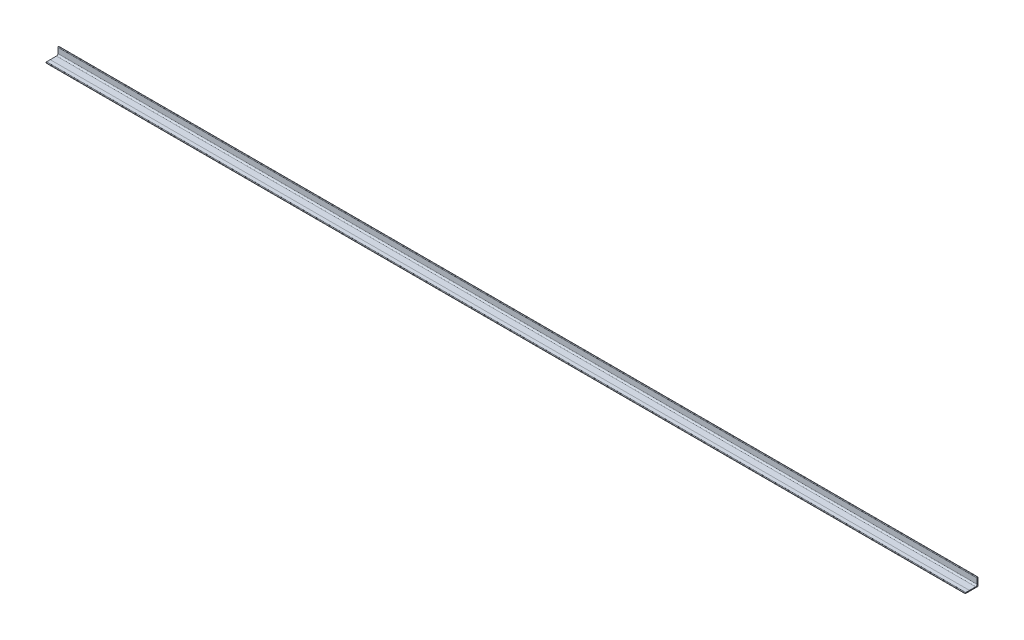
ISO-10303-21;
HEADER;
FILE_DESCRIPTION(('STEP AP214'),'2;1');
FILE_NAME('part.step','',(''),(''),'','','');
FILE_SCHEMA(('AUTOMOTIVE_DESIGN { 1 0 10303 214 1 1 1 1 }'));
ENDSEC;
DATA;
#1=APPLICATION_CONTEXT('core data for automotive mechanical design processes');
#2=APPLICATION_PROTOCOL_DEFINITION('international standard','automotive_design',2000,#1);
#3=PRODUCT_CONTEXT('',#1,'mechanical');
#4=PRODUCT('Part','Part','',(#3));
#5=PRODUCT_RELATED_PRODUCT_CATEGORY('part','',(#4));
#6=PRODUCT_DEFINITION_FORMATION('','',#4);
#7=PRODUCT_DEFINITION_CONTEXT('part definition',#1,'design');
#8=PRODUCT_DEFINITION('design','',#6,#7);
#9=PRODUCT_DEFINITION_SHAPE('','',#8);
#10=(LENGTH_UNIT() NAMED_UNIT(*) SI_UNIT(.MILLI.,.METRE.));
#11=(NAMED_UNIT(*) PLANE_ANGLE_UNIT() SI_UNIT($,.RADIAN.));
#12=(NAMED_UNIT(*) SI_UNIT($,.STERADIAN.) SOLID_ANGLE_UNIT());
#13=UNCERTAINTY_MEASURE_WITH_UNIT(LENGTH_MEASURE(1.E-05),#10,'distance_accuracy_value','');
#14=(GEOMETRIC_REPRESENTATION_CONTEXT(3) GLOBAL_UNCERTAINTY_ASSIGNED_CONTEXT((#13)) GLOBAL_UNIT_ASSIGNED_CONTEXT((#10,
#11,#12)) REPRESENTATION_CONTEXT('',''));
#15=CARTESIAN_POINT('',(0.,0.,0.));
#16=DIRECTION('',(0.,0.,1.));
#17=DIRECTION('',(1.,0.,0.));
#18=AXIS2_PLACEMENT_3D('',#15,#16,#17);
#19=CARTESIAN_POINT('',(0.,4.6,67.));
#20=DIRECTION('',(1.,0.,0.));
#21=DIRECTION('',(0.,0.,-1.));
#22=AXIS2_PLACEMENT_3D('',#19,#20,#21);
#23=PLANE('',#22);
#24=DIRECTION('',(0.,0.,1.));
#25=VECTOR('',#24,1.);
#26=CARTESIAN_POINT('',(0.,4.5,67.));
#27=LINE('',#26,#25);
#28=CARTESIAN_POINT('',(0.,4.5,47.));
#29=VERTEX_POINT('',#28);
#30=CARTESIAN_POINT('',(0.,4.5,67.));
#31=VERTEX_POINT('',#30);
#32=EDGE_CURVE('E142',#29,#31,#27,.T.);
#33=ORIENTED_EDGE('',*,*,#32,.T.);
#34=DIRECTION('',(0.,-1.,0.));
#35=VECTOR('',#34,1.);
#36=CARTESIAN_POINT('',(0.,4.6,67.));
#37=LINE('',#36,#35);
#38=CARTESIAN_POINT('',(0.,4.6,67.));
#39=VERTEX_POINT('',#38);
#40=EDGE_CURVE('E14',#39,#31,#37,.T.);
#41=ORIENTED_EDGE('',*,*,#40,.F.);
#42=DIRECTION('',(0.,0.,1.));
#43=VECTOR('',#42,1.);
#44=CARTESIAN_POINT('',(0.,4.6,67.));
#45=LINE('',#44,#43);
#46=CARTESIAN_POINT('',(0.,4.6,47.));
#47=VERTEX_POINT('',#46);
#48=EDGE_CURVE('E130',#47,#39,#45,.T.);
#49=ORIENTED_EDGE('',*,*,#48,.F.);
#50=DIRECTION('',(0.,-1.,0.));
#51=VECTOR('',#50,1.);
#52=CARTESIAN_POINT('',(0.,4.6,47.));
#53=LINE('',#52,#51);
#54=EDGE_CURVE('E138',#47,#29,#53,.T.);
#55=ORIENTED_EDGE('',*,*,#54,.T.);
#56=EDGE_LOOP('',(#33,#41,#49,#55));
#57=FACE_BOUND('',#56,.T.);
#58=ADVANCED_FACE('F79',(#57),#23,.F.);
#59=CARTESIAN_POINT('',(0.,4.6,67.));
#60=DIRECTION('',(0.,0.,-1.));
#61=DIRECTION('',(-1.,0.,0.));
#62=AXIS2_PLACEMENT_3D('',#59,#60,#61);
#63=PLANE('',#62);
#64=DIRECTION('',(1.,0.,0.));
#65=VECTOR('',#64,1.);
#66=CARTESIAN_POINT('',(0.,4.5,67.));
#67=LINE('',#66,#65);
#68=CARTESIAN_POINT('',(5060.,4.5,67.));
#69=VERTEX_POINT('',#68);
#70=EDGE_CURVE('E134',#31,#69,#67,.T.);
#71=ORIENTED_EDGE('',*,*,#70,.T.);
#72=DIRECTION('',(0.,-1.,0.));
#73=VECTOR('',#72,1.);
#74=CARTESIAN_POINT('',(5060.,4.6,67.));
#75=LINE('',#74,#73);
#76=CARTESIAN_POINT('',(5060.,4.6,67.));
#77=VERTEX_POINT('',#76);
#78=EDGE_CURVE('E87',#77,#69,#75,.T.);
#79=ORIENTED_EDGE('',*,*,#78,.F.);
#80=DIRECTION('',(1.,0.,0.));
#81=VECTOR('',#80,1.);
#82=CARTESIAN_POINT('',(0.,4.6,67.));
#83=LINE('',#82,#81);
#84=EDGE_CURVE('E125',#39,#77,#83,.T.);
#85=ORIENTED_EDGE('',*,*,#84,.F.);
#86=ORIENTED_EDGE('',*,*,#40,.T.);
#87=EDGE_LOOP('',(#71,#79,#85,#86));
#88=FACE_BOUND('',#87,.T.);
#89=ADVANCED_FACE('F133',(#88),#63,.F.);
#90=CARTESIAN_POINT('',(5060.,4.6,67.));
#91=DIRECTION('',(-1.,0.,0.));
#92=DIRECTION('',(0.,0.,1.));
#93=AXIS2_PLACEMENT_3D('',#90,#91,#92);
#94=PLANE('',#93);
#95=DIRECTION('',(0.,0.,-1.));
#96=VECTOR('',#95,1.);
#97=CARTESIAN_POINT('',(5060.,4.5,67.));
#98=LINE('',#97,#96);
#99=CARTESIAN_POINT('',(5060.,4.5,47.));
#100=VERTEX_POINT('',#99);
#101=EDGE_CURVE('E112',#69,#100,#98,.T.);
#102=ORIENTED_EDGE('',*,*,#101,.T.);
#103=DIRECTION('',(0.,-1.,0.));
#104=VECTOR('',#103,1.);
#105=CARTESIAN_POINT('',(5060.,4.6,47.));
#106=LINE('',#105,#104);
#107=CARTESIAN_POINT('',(5060.,4.6,47.));
#108=VERTEX_POINT('',#107);
#109=EDGE_CURVE('E135',#108,#100,#106,.T.);
#110=ORIENTED_EDGE('',*,*,#109,.F.);
#111=DIRECTION('',(0.,0.,-1.));
#112=VECTOR('',#111,1.);
#113=CARTESIAN_POINT('',(5060.,4.6,67.));
#114=LINE('',#113,#112);
#115=EDGE_CURVE('E128',#77,#108,#114,.T.);
#116=ORIENTED_EDGE('',*,*,#115,.F.);
#117=ORIENTED_EDGE('',*,*,#78,.T.);
#118=EDGE_LOOP('',(#102,#110,#116,#117));
#119=FACE_BOUND('',#118,.T.);
#120=ADVANCED_FACE('F136',(#119),#94,.F.);
#121=CARTESIAN_POINT('',(0.,4.6,47.));
#122=DIRECTION('',(0.,0.,1.));
#123=DIRECTION('',(1.,0.,0.));
#124=AXIS2_PLACEMENT_3D('',#121,#122,#123);
#125=PLANE('',#124);
#126=DIRECTION('',(-1.,0.,0.));
#127=VECTOR('',#126,1.);
#128=CARTESIAN_POINT('',(0.,4.5,47.));
#129=LINE('',#128,#127);
#130=EDGE_CURVE('E118',#100,#29,#129,.T.);
#131=ORIENTED_EDGE('',*,*,#130,.T.);
#132=ORIENTED_EDGE('',*,*,#54,.F.);
#133=DIRECTION('',(-1.,0.,0.));
#134=VECTOR('',#133,1.);
#135=CARTESIAN_POINT('',(0.,4.6,47.));
#136=LINE('',#135,#134);
#137=EDGE_CURVE('E95',#108,#47,#136,.T.);
#138=ORIENTED_EDGE('',*,*,#137,.F.);
#139=ORIENTED_EDGE('',*,*,#109,.T.);
#140=EDGE_LOOP('',(#131,#132,#138,#139));
#141=FACE_BOUND('',#140,.T.);
#142=ADVANCED_FACE('F149',(#141),#125,.F.);
#143=CARTESIAN_POINT('',(0.,4.6,0.));
#144=DIRECTION('',(0.,-1.,0.));
#145=DIRECTION('',(0.,0.,-1.));
#146=AXIS2_PLACEMENT_3D('',#143,#144,#145);
#147=PLANE('',#146);
#148=ORIENTED_EDGE('',*,*,#48,.T.);
#149=ORIENTED_EDGE('',*,*,#84,.T.);
#150=ORIENTED_EDGE('',*,*,#115,.T.);
#151=ORIENTED_EDGE('',*,*,#137,.T.);
#152=EDGE_LOOP('',(#148,#149,#150,#151));
#153=FACE_BOUND('',#152,.T.);
#154=ADVANCED_FACE('F126',(#153),#147,.F.);
#155=CARTESIAN_POINT('',(0.,4.5,0.));
#156=DIRECTION('',(0.,-1.,0.));
#157=DIRECTION('',(0.,0.,-1.));
#158=AXIS2_PLACEMENT_3D('',#155,#156,#157);
#159=PLANE('',#158);
#160=ORIENTED_EDGE('',*,*,#32,.F.);
#161=ORIENTED_EDGE('',*,*,#130,.F.);
#162=ORIENTED_EDGE('',*,*,#101,.F.);
#163=ORIENTED_EDGE('',*,*,#70,.F.);
#164=EDGE_LOOP('',(#160,#161,#162,#163));
#165=FACE_BOUND('',#164,.T.);
#166=ADVANCED_FACE('F152',(#165),#159,.T.);
#167=CLOSED_SHELL('',(#58,#89,#120,#142,#154,#166));
#168=MANIFOLD_SOLID_BREP('B2',#167);
#169=CARTESIAN_POINT('',(5060.,0.,0.));
#170=DIRECTION('',(0.,0.,1.));
#171=DIRECTION('',(1.,0.,0.));
#172=AXIS2_PLACEMENT_3D('',#169,#170,#171);
#173=PLANE('',#172);
#174=DIRECTION('',(0.,1.,0.));
#175=VECTOR('',#174,1.);
#176=CARTESIAN_POINT('',(0.,0.,0.));
#177=LINE('',#176,#175);
#178=CARTESIAN_POINT('',(0.,0.,0.));
#179=VERTEX_POINT('',#178);
#180=CARTESIAN_POINT('',(0.,45.,0.));
#181=VERTEX_POINT('',#180);
#182=EDGE_CURVE('E304',#179,#181,#177,.T.);
#183=ORIENTED_EDGE('',*,*,#182,.T.);
#184=DIRECTION('',(-1.,0.,0.));
#185=VECTOR('',#184,1.);
#186=CARTESIAN_POINT('',(5060.,45.,0.));
#187=LINE('',#186,#185);
#188=CARTESIAN_POINT('',(5060.,45.,0.));
#189=VERTEX_POINT('',#188);
#190=EDGE_CURVE('E77',#189,#181,#187,.T.);
#191=ORIENTED_EDGE('',*,*,#190,.F.);
#192=DIRECTION('',(0.,1.,0.));
#193=VECTOR('',#192,1.);
#194=CARTESIAN_POINT('',(5060.,0.,0.));
#195=LINE('',#194,#193);
#196=CARTESIAN_POINT('',(5060.,0.,0.));
#197=VERTEX_POINT('',#196);
#198=EDGE_CURVE('E320',#197,#189,#195,.T.);
#199=ORIENTED_EDGE('',*,*,#198,.F.);
#200=DIRECTION('',(-1.,0.,0.));
#201=VECTOR('',#200,1.);
#202=CARTESIAN_POINT('',(5060.,0.,0.));
#203=LINE('',#202,#201);
#204=EDGE_CURVE('E300',#197,#179,#203,.T.);
#205=ORIENTED_EDGE('',*,*,#204,.T.);
#206=EDGE_LOOP('',(#183,#191,#199,#205));
#207=FACE_BOUND('',#206,.T.);
#208=ADVANCED_FACE('F202',(#207),#173,.F.);
#209=CARTESIAN_POINT('',(5060.,45.,0.));
#210=DIRECTION('',(0.,-1.,0.));
#211=DIRECTION('',(0.,0.,-1.));
#212=AXIS2_PLACEMENT_3D('',#209,#210,#211);
#213=PLANE('',#212);
#214=DIRECTION('',(0.,0.,1.));
#215=VECTOR('',#214,1.);
#216=CARTESIAN_POINT('',(0.,45.,0.));
#217=LINE('',#216,#215);
#218=CARTESIAN_POINT('',(0.,45.,1.49999999999998));
#219=VERTEX_POINT('',#218);
#220=EDGE_CURVE('E307',#181,#219,#217,.T.);
#221=ORIENTED_EDGE('',*,*,#220,.T.);
#222=DIRECTION('',(-1.,0.,0.));
#223=VECTOR('',#222,1.);
#224=CARTESIAN_POINT('',(5060.,45.,1.49999999999998));
#225=LINE('',#224,#223);
#226=CARTESIAN_POINT('',(5060.,45.,1.49999999999998));
#227=VERTEX_POINT('',#226);
#228=EDGE_CURVE('E210',#227,#219,#225,.T.);
#229=ORIENTED_EDGE('',*,*,#228,.F.);
#230=DIRECTION('',(0.,0.,1.));
#231=VECTOR('',#230,1.);
#232=CARTESIAN_POINT('',(5060.,45.,0.));
#233=LINE('',#232,#231);
#234=EDGE_CURVE('E264',#189,#227,#233,.T.);
#235=ORIENTED_EDGE('',*,*,#234,.F.);
#236=ORIENTED_EDGE('',*,*,#190,.T.);
#237=EDGE_LOOP('',(#221,#229,#235,#236));
#238=FACE_BOUND('',#237,.T.);
#239=ADVANCED_FACE('F363',(#238),#213,.F.);
#240=CARTESIAN_POINT('',(5060.,42.,1.5));
#241=DIRECTION('',(-1.,0.,0.));
#242=DIRECTION('',(0.,0.,1.));
#243=AXIS2_PLACEMENT_3D('',#240,#241,#242);
#244=CYLINDRICAL_SURFACE('',#243,3.);
#245=CARTESIAN_POINT('',(0.,42.,1.5));
#246=DIRECTION('',(1.,0.,0.));
#247=DIRECTION('',(0.,0.,-1.));
#248=AXIS2_PLACEMENT_3D('',#245,#246,#247);
#249=CIRCLE('',#248,3.);
#250=CARTESIAN_POINT('',(0.,42.,4.5));
#251=VERTEX_POINT('',#250);
#252=EDGE_CURVE('E309',#219,#251,#249,.T.);
#253=ORIENTED_EDGE('',*,*,#252,.T.);
#254=DIRECTION('',(-1.,0.,0.));
#255=VECTOR('',#254,1.);
#256=CARTESIAN_POINT('',(5060.,42.,4.5));
#257=LINE('',#256,#255);
#258=CARTESIAN_POINT('',(5060.,42.,4.5));
#259=VERTEX_POINT('',#258);
#260=EDGE_CURVE('E330',#259,#251,#257,.T.);
#261=ORIENTED_EDGE('',*,*,#260,.F.);
#262=CARTESIAN_POINT('',(5060.,42.,1.5));
#263=DIRECTION('',(1.,0.,0.));
#264=DIRECTION('',(0.,0.,-1.));
#265=AXIS2_PLACEMENT_3D('',#262,#263,#264);
#266=CIRCLE('',#265,3.);
#267=EDGE_CURVE('E338',#227,#259,#266,.T.);
#268=ORIENTED_EDGE('',*,*,#267,.F.);
#269=ORIENTED_EDGE('',*,*,#228,.T.);
#270=EDGE_LOOP('',(#253,#261,#268,#269));
#271=FACE_BOUND('',#270,.T.);
#272=ADVANCED_FACE('F336',(#271),#244,.T.);
#273=CARTESIAN_POINT('',(5060.,12.5000000000001,4.5));
#274=DIRECTION('',(0.,0.,-1.));
#275=DIRECTION('',(-1.,0.,0.));
#276=AXIS2_PLACEMENT_3D('',#273,#274,#275);
#277=PLANE('',#276);
#278=DIRECTION('',(0.,-1.,0.));
#279=VECTOR('',#278,1.);
#280=CARTESIAN_POINT('',(0.,12.5000000000001,4.5));
#281=LINE('',#280,#279);
#282=CARTESIAN_POINT('',(0.,12.5000000000001,4.5));
#283=VERTEX_POINT('',#282);
#284=EDGE_CURVE('E311',#251,#283,#281,.T.);
#285=ORIENTED_EDGE('',*,*,#284,.T.);
#286=DIRECTION('',(-1.,0.,0.));
#287=VECTOR('',#286,1.);
#288=CARTESIAN_POINT('',(5060.,12.5000000000001,4.5));
#289=LINE('',#288,#287);
#290=CARTESIAN_POINT('',(5060.,12.5000000000001,4.5));
#291=VERTEX_POINT('',#290);
#292=EDGE_CURVE('E327',#291,#283,#289,.T.);
#293=ORIENTED_EDGE('',*,*,#292,.F.);
#294=DIRECTION('',(0.,-1.,0.));
#295=VECTOR('',#294,1.);
#296=CARTESIAN_POINT('',(5060.,12.5000000000001,4.5));
#297=LINE('',#296,#295);
#298=EDGE_CURVE('E354',#259,#291,#297,.T.);
#299=ORIENTED_EDGE('',*,*,#298,.F.);
#300=ORIENTED_EDGE('',*,*,#260,.T.);
#301=EDGE_LOOP('',(#285,#293,#299,#300));
#302=FACE_BOUND('',#301,.T.);
#303=ADVANCED_FACE('F347',(#302),#277,.F.);
#304=CARTESIAN_POINT('',(5060.,12.5,12.5));
#305=DIRECTION('',(-1.,0.,0.));
#306=DIRECTION('',(0.,0.,1.));
#307=AXIS2_PLACEMENT_3D('',#304,#305,#306);
#308=CYLINDRICAL_SURFACE('',#307,8.);
#309=CARTESIAN_POINT('',(0.,12.5,12.5));
#310=DIRECTION('',(-1.,0.,0.));
#311=DIRECTION('',(0.,0.,1.));
#312=AXIS2_PLACEMENT_3D('',#309,#310,#311);
#313=CIRCLE('',#312,8.);
#314=CARTESIAN_POINT('',(0.,4.5,12.5000000000001));
#315=VERTEX_POINT('',#314);
#316=EDGE_CURVE('E313',#283,#315,#313,.T.);
#317=ORIENTED_EDGE('',*,*,#316,.T.);
#318=DIRECTION('',(-1.,0.,0.));
#319=VECTOR('',#318,1.);
#320=CARTESIAN_POINT('',(5060.,4.5,12.5000000000001));
#321=LINE('',#320,#319);
#322=CARTESIAN_POINT('',(5060.,4.5,12.5000000000001));
#323=VERTEX_POINT('',#322);
#324=EDGE_CURVE('E324',#323,#315,#321,.T.);
#325=ORIENTED_EDGE('',*,*,#324,.F.);
#326=CARTESIAN_POINT('',(5060.,12.5,12.5));
#327=DIRECTION('',(-1.,0.,0.));
#328=DIRECTION('',(0.,0.,1.));
#329=AXIS2_PLACEMENT_3D('',#326,#327,#328);
#330=CIRCLE('',#329,8.);
#331=EDGE_CURVE('E353',#291,#323,#330,.T.);
#332=ORIENTED_EDGE('',*,*,#331,.F.);
#333=ORIENTED_EDGE('',*,*,#292,.T.);
#334=EDGE_LOOP('',(#317,#325,#332,#333));
#335=FACE_BOUND('',#334,.T.);
#336=ADVANCED_FACE('F351',(#335),#308,.F.);
#337=CARTESIAN_POINT('',(5060.,4.5,12.5000000000001));
#338=DIRECTION('',(0.,-1.,0.));
#339=DIRECTION('',(0.,0.,-1.));
#340=AXIS2_PLACEMENT_3D('',#337,#338,#339);
#341=PLANE('',#340);
#342=DIRECTION('',(0.,0.,1.));
#343=VECTOR('',#342,1.);
#344=CARTESIAN_POINT('',(0.,4.5,12.5000000000001));
#345=LINE('',#344,#343);
#346=CARTESIAN_POINT('',(0.,4.5,67.));
#347=VERTEX_POINT('',#346);
#348=EDGE_CURVE('E315',#315,#347,#345,.T.);
#349=ORIENTED_EDGE('',*,*,#348,.T.);
#350=DIRECTION('',(-1.,0.,0.));
#351=VECTOR('',#350,1.);
#352=CARTESIAN_POINT('',(5060.,4.5,67.));
#353=LINE('',#352,#351);
#354=CARTESIAN_POINT('',(5060.,4.5,67.));
#355=VERTEX_POINT('',#354);
#356=EDGE_CURVE('E295',#355,#347,#353,.T.);
#357=ORIENTED_EDGE('',*,*,#356,.F.);
#358=DIRECTION('',(0.,0.,1.));
#359=VECTOR('',#358,1.);
#360=CARTESIAN_POINT('',(5060.,4.5,12.5000000000001));
#361=LINE('',#360,#359);
#362=EDGE_CURVE('E286',#323,#355,#361,.T.);
#363=ORIENTED_EDGE('',*,*,#362,.F.);
#364=ORIENTED_EDGE('',*,*,#324,.T.);
#365=EDGE_LOOP('',(#349,#357,#363,#364));
#366=FACE_BOUND('',#365,.T.);
#367=ADVANCED_FACE('F375',(#366),#341,.F.);
#368=CARTESIAN_POINT('',(5060.,1.5,67.));
#369=DIRECTION('',(-1.,0.,0.));
#370=DIRECTION('',(0.,0.,1.));
#371=AXIS2_PLACEMENT_3D('',#368,#369,#370);
#372=CYLINDRICAL_SURFACE('',#371,3.);
#373=CARTESIAN_POINT('',(0.,1.5,67.));
#374=DIRECTION('',(1.,0.,0.));
#375=DIRECTION('',(0.,0.,-1.));
#376=AXIS2_PLACEMENT_3D('',#373,#374,#375);
#377=CIRCLE('',#376,3.);
#378=CARTESIAN_POINT('',(0.,1.49999999999998,70.));
#379=VERTEX_POINT('',#378);
#380=EDGE_CURVE('E294',#347,#379,#377,.T.);
#381=ORIENTED_EDGE('',*,*,#380,.T.);
#382=DIRECTION('',(-1.,0.,0.));
#383=VECTOR('',#382,1.);
#384=CARTESIAN_POINT('',(5060.,1.49999999999998,70.));
#385=LINE('',#384,#383);
#386=CARTESIAN_POINT('',(5060.,1.49999999999998,70.));
#387=VERTEX_POINT('',#386);
#388=EDGE_CURVE('E291',#387,#379,#385,.T.);
#389=ORIENTED_EDGE('',*,*,#388,.F.);
#390=CARTESIAN_POINT('',(5060.,1.5,67.));
#391=DIRECTION('',(1.,0.,0.));
#392=DIRECTION('',(0.,0.,-1.));
#393=AXIS2_PLACEMENT_3D('',#390,#391,#392);
#394=CIRCLE('',#393,3.);
#395=EDGE_CURVE('E280',#355,#387,#394,.T.);
#396=ORIENTED_EDGE('',*,*,#395,.F.);
#397=ORIENTED_EDGE('',*,*,#356,.T.);
#398=EDGE_LOOP('',(#381,#389,#396,#397));
#399=FACE_BOUND('',#398,.T.);
#400=ADVANCED_FACE('F292',(#399),#372,.T.);
#401=CARTESIAN_POINT('',(5060.,0.,70.));
#402=DIRECTION('',(0.,0.,-1.));
#403=DIRECTION('',(-1.,0.,0.));
#404=AXIS2_PLACEMENT_3D('',#401,#402,#403);
#405=PLANE('',#404);
#406=DIRECTION('',(0.,-1.,0.));
#407=VECTOR('',#406,1.);
#408=CARTESIAN_POINT('',(0.,0.,70.));
#409=LINE('',#408,#407);
#410=CARTESIAN_POINT('',(0.,0.,70.));
#411=VERTEX_POINT('',#410);
#412=EDGE_CURVE('E250',#379,#411,#409,.T.);
#413=ORIENTED_EDGE('',*,*,#412,.T.);
#414=DIRECTION('',(-1.,0.,0.));
#415=VECTOR('',#414,1.);
#416=CARTESIAN_POINT('',(5060.,0.,70.));
#417=LINE('',#416,#415);
#418=CARTESIAN_POINT('',(5060.,0.,70.));
#419=VERTEX_POINT('',#418);
#420=EDGE_CURVE('E296',#419,#411,#417,.T.);
#421=ORIENTED_EDGE('',*,*,#420,.F.);
#422=DIRECTION('',(0.,-1.,0.));
#423=VECTOR('',#422,1.);
#424=CARTESIAN_POINT('',(5060.,0.,70.));
#425=LINE('',#424,#423);
#426=EDGE_CURVE('E284',#387,#419,#425,.T.);
#427=ORIENTED_EDGE('',*,*,#426,.F.);
#428=ORIENTED_EDGE('',*,*,#388,.T.);
#429=EDGE_LOOP('',(#413,#421,#427,#428));
#430=FACE_BOUND('',#429,.T.);
#431=ADVANCED_FACE('F298',(#430),#405,.F.);
#432=CARTESIAN_POINT('',(5060.,0.,0.));
#433=DIRECTION('',(0.,1.,0.));
#434=DIRECTION('',(0.,0.,1.));
#435=AXIS2_PLACEMENT_3D('',#432,#433,#434);
#436=PLANE('',#435);
#437=DIRECTION('',(0.,0.,-1.));
#438=VECTOR('',#437,1.);
#439=CARTESIAN_POINT('',(0.,0.,0.));
#440=LINE('',#439,#438);
#441=EDGE_CURVE('E256',#411,#179,#440,.T.);
#442=ORIENTED_EDGE('',*,*,#441,.T.);
#443=ORIENTED_EDGE('',*,*,#204,.F.);
#444=DIRECTION('',(0.,0.,-1.));
#445=VECTOR('',#444,1.);
#446=CARTESIAN_POINT('',(5060.,0.,0.));
#447=LINE('',#446,#445);
#448=EDGE_CURVE('E218',#419,#197,#447,.T.);
#449=ORIENTED_EDGE('',*,*,#448,.F.);
#450=ORIENTED_EDGE('',*,*,#420,.T.);
#451=EDGE_LOOP('',(#442,#443,#449,#450));
#452=FACE_BOUND('',#451,.T.);
#453=ADVANCED_FACE('F383',(#452),#436,.F.);
#454=CARTESIAN_POINT('',(5060.,42.,1.5));
#455=DIRECTION('',(1.,0.,0.));
#456=DIRECTION('',(0.,0.,-1.));
#457=AXIS2_PLACEMENT_3D('',#454,#455,#456);
#458=PLANE('',#457);
#459=ORIENTED_EDGE('',*,*,#198,.T.);
#460=ORIENTED_EDGE('',*,*,#234,.T.);
#461=ORIENTED_EDGE('',*,*,#267,.T.);
#462=ORIENTED_EDGE('',*,*,#298,.T.);
#463=ORIENTED_EDGE('',*,*,#331,.T.);
#464=ORIENTED_EDGE('',*,*,#362,.T.);
#465=ORIENTED_EDGE('',*,*,#395,.T.);
#466=ORIENTED_EDGE('',*,*,#426,.T.);
#467=ORIENTED_EDGE('',*,*,#448,.T.);
#468=EDGE_LOOP('',(#459,#460,#461,#462,#463,#464,#465,#466,#467));
#469=FACE_BOUND('',#468,.T.);
#470=ADVANCED_FACE('F282',(#469),#458,.T.);
#471=CARTESIAN_POINT('',(0.,42.,1.5));
#472=DIRECTION('',(1.,0.,0.));
#473=DIRECTION('',(0.,0.,-1.));
#474=AXIS2_PLACEMENT_3D('',#471,#472,#473);
#475=PLANE('',#474);
#476=ORIENTED_EDGE('',*,*,#182,.F.);
#477=ORIENTED_EDGE('',*,*,#441,.F.);
#478=ORIENTED_EDGE('',*,*,#412,.F.);
#479=ORIENTED_EDGE('',*,*,#380,.F.);
#480=ORIENTED_EDGE('',*,*,#348,.F.);
#481=ORIENTED_EDGE('',*,*,#316,.F.);
#482=ORIENTED_EDGE('',*,*,#284,.F.);
#483=ORIENTED_EDGE('',*,*,#252,.F.);
#484=ORIENTED_EDGE('',*,*,#220,.F.);
#485=EDGE_LOOP('',(#476,#477,#478,#479,#480,#481,#482,#483,#484));
#486=FACE_BOUND('',#485,.T.);
#487=ADVANCED_FACE('F342',(#486),#475,.F.);
#488=CLOSED_SHELL('',(#208,#239,#272,#303,#336,#367,#400,#431,#453,#470,#487));
#489=MANIFOLD_SOLID_BREP('B8',#488);
#490=ADVANCED_BREP_SHAPE_REPRESENTATION('',(#18,#168,#489),#14);
#491=SHAPE_DEFINITION_REPRESENTATION(#9,#490);
ENDSEC;
END-ISO-10303-21;
